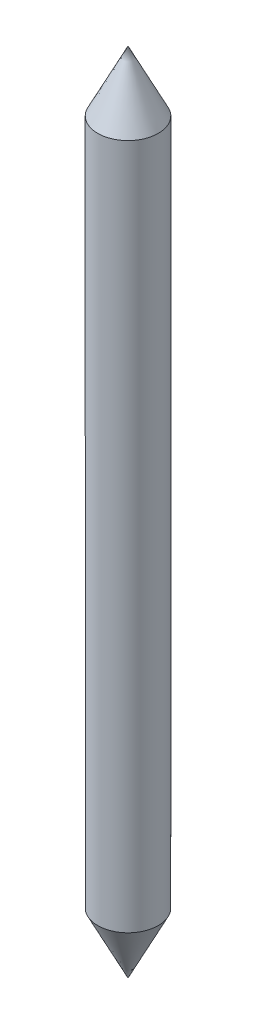
ISO-10303-21;
HEADER;
FILE_DESCRIPTION(('STEP AP214'),'2;1');
FILE_NAME('part.step','',(''),(''),'','','');
FILE_SCHEMA(('AUTOMOTIVE_DESIGN { 1 0 10303 214 1 1 1 1 }'));
ENDSEC;
DATA;
#1=APPLICATION_CONTEXT('core data for automotive mechanical design processes');
#2=APPLICATION_PROTOCOL_DEFINITION('international standard','automotive_design',2000,#1);
#3=PRODUCT_CONTEXT('',#1,'mechanical');
#4=PRODUCT('Part','Part','',(#3));
#5=PRODUCT_RELATED_PRODUCT_CATEGORY('part','',(#4));
#6=PRODUCT_DEFINITION_FORMATION('','',#4);
#7=PRODUCT_DEFINITION_CONTEXT('part definition',#1,'design');
#8=PRODUCT_DEFINITION('design','',#6,#7);
#9=PRODUCT_DEFINITION_SHAPE('','',#8);
#10=(LENGTH_UNIT() NAMED_UNIT(*) SI_UNIT(.MILLI.,.METRE.));
#11=(NAMED_UNIT(*) PLANE_ANGLE_UNIT() SI_UNIT($,.RADIAN.));
#12=(NAMED_UNIT(*) SI_UNIT($,.STERADIAN.) SOLID_ANGLE_UNIT());
#13=UNCERTAINTY_MEASURE_WITH_UNIT(LENGTH_MEASURE(1.E-05),#10,'distance_accuracy_value','');
#14=(GEOMETRIC_REPRESENTATION_CONTEXT(3) GLOBAL_UNCERTAINTY_ASSIGNED_CONTEXT((#13)) GLOBAL_UNIT_ASSIGNED_CONTEXT((#10,
#11,#12)) REPRESENTATION_CONTEXT('',''));
#15=CARTESIAN_POINT('',(0.,0.,0.));
#16=DIRECTION('',(0.,0.,1.));
#17=DIRECTION('',(1.,0.,0.));
#18=AXIS2_PLACEMENT_3D('',#15,#16,#17);
#19=CARTESIAN_POINT('',(-1.86869509208316,16.7062665180691,0.));
#20=DIRECTION('',(0.,1.,0.));
#21=DIRECTION('',(0.,0.,1.));
#22=AXIS2_PLACEMENT_3D('',#19,#20,#21);
#23=CONICAL_SURFACE('',#22,0.,0.463647609000808);
#24=CARTESIAN_POINT('',(-1.86869509208316,17.4562665180691,0.));
#25=DIRECTION('',(0.,-1.,0.));
#26=DIRECTION('',(0.,0.,-1.));
#27=AXIS2_PLACEMENT_3D('',#24,#25,#26);
#28=CIRCLE('',#27,0.375);
#29=CARTESIAN_POINT('',(-1.86869509208316,17.4562665180691,-0.375));
#30=VERTEX_POINT('',#29);
#31=EDGE_CURVE('E11',#30,#30,#28,.T.);
#32=ORIENTED_EDGE('',*,*,#31,.T.);
#33=EDGE_LOOP('',(#32));
#34=FACE_BOUND('',#33,.T.);
#35=CARTESIAN_POINT('',(-1.86869509208316,16.7062665180691,0.));
#36=VERTEX_POINT('',#35);
#37=VERTEX_LOOP('',#36);
#38=FACE_BOUND('',#37,.T.);
#39=ADVANCED_FACE('F30',(#34,#38),#23,.T.);
#40=CARTESIAN_POINT('',(-1.86869509208316,16.7062665180691,0.));
#41=DIRECTION('',(0.,-1.,0.));
#42=DIRECTION('',(0.,0.,-1.));
#43=AXIS2_PLACEMENT_3D('',#40,#41,#42);
#44=CYLINDRICAL_SURFACE('',#43,0.375);
#45=CARTESIAN_POINT('',(-1.86869509208316,25.9562665180691,0.));
#46=DIRECTION('',(0.,-1.,0.));
#47=DIRECTION('',(0.,0.,-1.));
#48=AXIS2_PLACEMENT_3D('',#45,#46,#47);
#49=CIRCLE('',#48,0.375);
#50=CARTESIAN_POINT('',(-1.86869509208316,25.9562665180691,-0.375));
#51=VERTEX_POINT('',#50);
#52=EDGE_CURVE('E37',#51,#51,#49,.T.);
#53=ORIENTED_EDGE('',*,*,#52,.T.);
#54=EDGE_LOOP('',(#53));
#55=FACE_BOUND('',#54,.T.);
#56=ORIENTED_EDGE('',*,*,#31,.F.);
#57=EDGE_LOOP('',(#56));
#58=FACE_BOUND('',#57,.T.);
#59=ADVANCED_FACE('F44',(#55,#58),#44,.T.);
#60=CARTESIAN_POINT('',(-1.86869509208316,25.9562665180691,0.));
#61=DIRECTION('',(0.,-1.,0.));
#62=DIRECTION('',(0.,0.,-1.));
#63=AXIS2_PLACEMENT_3D('',#60,#61,#62);
#64=CONICAL_SURFACE('',#63,0.375,0.463647609000806);
#65=CARTESIAN_POINT('',(-1.86869509208316,26.7062665180691,0.));
#66=VERTEX_POINT('',#65);
#67=VERTEX_LOOP('',#66);
#68=FACE_BOUND('',#67,.T.);
#69=ORIENTED_EDGE('',*,*,#52,.F.);
#70=EDGE_LOOP('',(#69));
#71=FACE_BOUND('',#70,.T.);
#72=ADVANCED_FACE('F49',(#68,#71),#64,.T.);
#73=CLOSED_SHELL('',(#39,#59,#72));
#74=MANIFOLD_SOLID_BREP('B2',#73);
#75=ADVANCED_BREP_SHAPE_REPRESENTATION('',(#18,#74),#14);
#76=SHAPE_DEFINITION_REPRESENTATION(#9,#75);
ENDSEC;
END-ISO-10303-21;
